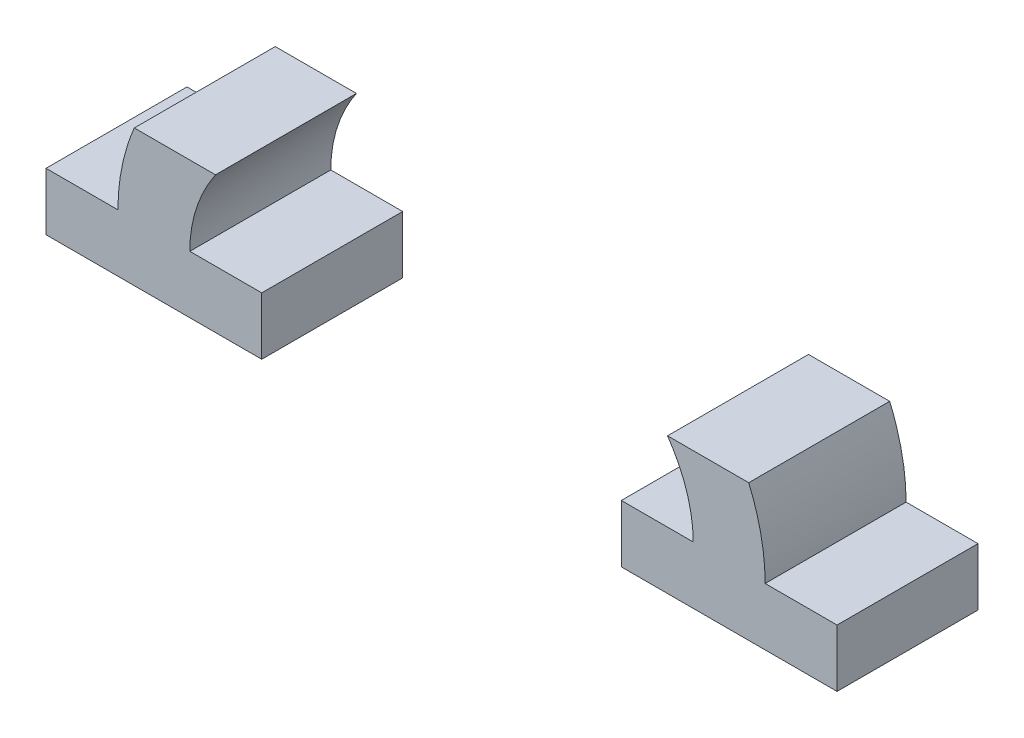
ISO-10303-21;
HEADER;
FILE_DESCRIPTION(('STEP AP214'),'2;1');
FILE_NAME('part.step','',(''),(''),'','','');
FILE_SCHEMA(('AUTOMOTIVE_DESIGN { 1 0 10303 214 1 1 1 1 }'));
ENDSEC;
DATA;
#1=APPLICATION_CONTEXT('core data for automotive mechanical design processes');
#2=APPLICATION_PROTOCOL_DEFINITION('international standard','automotive_design',2000,#1);
#3=PRODUCT_CONTEXT('',#1,'mechanical');
#4=PRODUCT('Part','Part','',(#3));
#5=PRODUCT_RELATED_PRODUCT_CATEGORY('part','',(#4));
#6=PRODUCT_DEFINITION_FORMATION('','',#4);
#7=PRODUCT_DEFINITION_CONTEXT('part definition',#1,'design');
#8=PRODUCT_DEFINITION('design','',#6,#7);
#9=PRODUCT_DEFINITION_SHAPE('','',#8);
#10=(LENGTH_UNIT() NAMED_UNIT(*) SI_UNIT(.MILLI.,.METRE.));
#11=(NAMED_UNIT(*) PLANE_ANGLE_UNIT() SI_UNIT($,.RADIAN.));
#12=(NAMED_UNIT(*) SI_UNIT($,.STERADIAN.) SOLID_ANGLE_UNIT());
#13=UNCERTAINTY_MEASURE_WITH_UNIT(LENGTH_MEASURE(1.E-05),#10,'distance_accuracy_value','');
#14=(GEOMETRIC_REPRESENTATION_CONTEXT(3) GLOBAL_UNCERTAINTY_ASSIGNED_CONTEXT((#13)) GLOBAL_UNIT_ASSIGNED_CONTEXT((#10,
#11,#12)) REPRESENTATION_CONTEXT('',''));
#15=CARTESIAN_POINT('',(0.,0.,0.));
#16=DIRECTION('',(0.,0.,1.));
#17=DIRECTION('',(1.,0.,0.));
#18=AXIS2_PLACEMENT_3D('',#15,#16,#17);
#19=CARTESIAN_POINT('',(-21.3177265453792,7.60000018535409,9.8));
#20=CARTESIAN_POINT('',(-21.4111901957209,7.3786729790947,9.8));
#21=CARTESIAN_POINT('',(-21.5030503403222,7.15674308126442,9.8));
#22=CARTESIAN_POINT('',(-21.6725730609992,6.70754700606256,9.8));
#23=CARTESIAN_POINT('',(-21.7518065374693,6.48087126525906,9.8));
#24=CARTESIAN_POINT('',(-21.9726166268598,5.79449566173458,9.8));
#25=CARTESIAN_POINT('',(-22.0966384821658,5.33062626410484,9.8));
#26=CARTESIAN_POINT('',(-22.2969341143173,4.39036394742074,9.8));
#27=CARTESIAN_POINT('',(-22.3727297923464,3.91620519370957,9.8));
#28=CARTESIAN_POINT('',(-22.4489857839461,3.19918391366948,9.8));
#29=CARTESIAN_POINT('',(-22.4680928075326,2.95979608998371,9.8));
#30=CARTESIAN_POINT('',(-22.4936050503093,2.4803943201275,9.8));
#31=CARTESIAN_POINT('',(-22.4986095178274,2.24028320897447,9.8));
#32=CARTESIAN_POINT('',(-22.5003620168882,1.99999999999999,9.8));
#33=B_SPLINE_CURVE_WITH_KNOTS('',3,(#19,#20,#21,#22,#23,#24,#25,#26,#27,#28,#29,#30,#31,#32),
.UNSPECIFIED.,.F.,.F.,(4,2,2,2,2,2,4),(0.,0.125,0.25,0.5,0.75,0.875,1.),.UNSPECIFIED.);
#34=DIRECTION('',(0.,0.,-1.));
#35=VECTOR('',#34,1.);
#36=SURFACE_OF_LINEAR_EXTRUSION('',#33,#35);
#37=CARTESIAN_POINT('',(-21.3598072357344,7.50000018487524,0.));
#38=CARTESIAN_POINT('',(-21.4386855313831,7.31179641084974,0.));
#39=CARTESIAN_POINT('',(-21.5158098291319,7.12293338146712,0.));
#40=CARTESIAN_POINT('',(-21.6725730609992,6.70754700606256,0.));
#41=CARTESIAN_POINT('',(-21.7518065374693,6.48087126525906,0.));
#42=CARTESIAN_POINT('',(-21.9726166268598,5.79449566173458,0.));
#43=CARTESIAN_POINT('',(-22.0966384821658,5.33062626410484,0.));
#44=CARTESIAN_POINT('',(-22.2969341143173,4.39036394742074,0.));
#45=CARTESIAN_POINT('',(-22.3727297923464,3.91620519370957,0.));
#46=CARTESIAN_POINT('',(-22.4489857839461,3.19918391366948,0.));
#47=CARTESIAN_POINT('',(-22.4680928075326,2.95979608998371,0.));
#48=CARTESIAN_POINT('',(-22.4936050503093,2.4803943201275,0.));
#49=CARTESIAN_POINT('',(-22.4986095178274,2.24028320897447,0.));
#50=CARTESIAN_POINT('',(-22.5003620168882,1.99999999999999,0.));
#51=B_SPLINE_CURVE_WITH_KNOTS('',3,(#37,#38,#39,#40,#41,#42,#43,#44,#45,#46,#47,#48,#49,#50),
.UNSPECIFIED.,.F.,.F.,(4,2,2,2,2,2,4),(0.0188167827279608,0.125,0.25,0.5,0.75,0.875,1.),.UNSPECIFIED.);
#52=CARTESIAN_POINT('',(-21.3598072357345,7.50000018487491,0.));
#53=VERTEX_POINT('',#52);
#54=CARTESIAN_POINT('',(-22.5003620168882,1.99999999999999,0.));
#55=VERTEX_POINT('',#54);
#56=EDGE_CURVE('E227',#53,#55,#51,.T.);
#57=ORIENTED_EDGE('',*,*,#56,.T.);
#58=DIRECTION('',(0.,0.,-1.));
#59=VECTOR('',#58,1.);
#60=CARTESIAN_POINT('',(-22.5003620168882,1.99999999999999,9.8));
#61=LINE('',#60,#59);
#62=CARTESIAN_POINT('',(-22.5003620168882,1.99999999999999,9.8));
#63=VERTEX_POINT('',#62);
#64=EDGE_CURVE('E12',#63,#55,#61,.T.);
#65=ORIENTED_EDGE('',*,*,#64,.F.);
#66=CARTESIAN_POINT('',(-22.5003620168882,1.99999999999999,9.8));
#67=CARTESIAN_POINT('',(-22.4986095178274,2.24028320897447,9.8));
#68=CARTESIAN_POINT('',(-22.4936050503093,2.4803943201275,9.8));
#69=CARTESIAN_POINT('',(-22.4680928075326,2.95979608998371,9.8));
#70=CARTESIAN_POINT('',(-22.4489857839461,3.19918391366948,9.8));
#71=CARTESIAN_POINT('',(-22.3727297923464,3.91620519370957,9.8));
#72=CARTESIAN_POINT('',(-22.2969341143173,4.39036394742074,9.8));
#73=CARTESIAN_POINT('',(-22.0966384821658,5.33062626410484,9.8));
#74=CARTESIAN_POINT('',(-21.9726166268598,5.79449566173458,9.8));
#75=CARTESIAN_POINT('',(-21.7518065374693,6.48087126525906,9.8));
#76=CARTESIAN_POINT('',(-21.6725730609992,6.70754700606256,9.8));
#77=CARTESIAN_POINT('',(-21.5158098291319,7.12293338146712,9.8));
#78=CARTESIAN_POINT('',(-21.4386855313831,7.31179641084974,9.8));
#79=CARTESIAN_POINT('',(-21.3598072357344,7.50000018487524,9.8));
#80=B_SPLINE_CURVE_WITH_KNOTS('',3,(#66,#67,#68,#69,#70,#71,#72,#73,#74,#75,#76,#77,#78,#79),
.UNSPECIFIED.,.F.,.F.,(4,2,2,2,2,2,4),(0.0188167827279608,0.143816782727961,0.268816782727961,
0.518816782727961,0.768816782727961,0.893816782727961,1.),.UNSPECIFIED.);
#81=CARTESIAN_POINT('',(-21.3598072357345,7.50000018487491,9.8));
#82=VERTEX_POINT('',#81);
#83=EDGE_CURVE('E213',#82,#63,#80,.F.);
#84=ORIENTED_EDGE('',*,*,#83,.F.);
#85=DIRECTION('',(0.,0.,-1.));
#86=VECTOR('',#85,1.);
#87=CARTESIAN_POINT('',(-21.3598072357345,7.50000018487491,9.8));
#88=LINE('',#87,#86);
#89=EDGE_CURVE('E278',#82,#53,#88,.T.);
#90=ORIENTED_EDGE('',*,*,#89,.T.);
#91=EDGE_LOOP('',(#57,#65,#84,#90));
#92=FACE_BOUND('',#91,.T.);
#93=ADVANCED_FACE('F43',(#92),#36,.F.);
#94=CARTESIAN_POINT('',(-27.5,1.99999999999999,9.8));
#95=DIRECTION('',(0.,-1.,0.));
#96=DIRECTION('',(1.,0.,0.));
#97=AXIS2_PLACEMENT_3D('',#94,#95,#96);
#98=PLANE('',#97);
#99=DIRECTION('',(-1.,0.,0.));
#100=VECTOR('',#99,1.);
#101=CARTESIAN_POINT('',(-27.5,1.99999999999999,0.));
#102=LINE('',#101,#100);
#103=CARTESIAN_POINT('',(-27.5,1.99999999999999,0.));
#104=VERTEX_POINT('',#103);
#105=EDGE_CURVE('E176',#55,#104,#102,.T.);
#106=ORIENTED_EDGE('',*,*,#105,.T.);
#107=DIRECTION('',(0.,0.,-1.));
#108=VECTOR('',#107,1.);
#109=CARTESIAN_POINT('',(-27.5,1.99999999999999,9.8));
#110=LINE('',#109,#108);
#111=CARTESIAN_POINT('',(-27.5,1.99999999999999,9.8));
#112=VERTEX_POINT('',#111);
#113=EDGE_CURVE('E54',#112,#104,#110,.T.);
#114=ORIENTED_EDGE('',*,*,#113,.F.);
#115=DIRECTION('',(-1.,0.,0.));
#116=VECTOR('',#115,1.);
#117=CARTESIAN_POINT('',(-27.5,1.99999999999999,9.8));
#118=LINE('',#117,#116);
#119=EDGE_CURVE('E107',#63,#112,#118,.T.);
#120=ORIENTED_EDGE('',*,*,#119,.F.);
#121=ORIENTED_EDGE('',*,*,#64,.T.);
#122=EDGE_LOOP('',(#106,#114,#120,#121));
#123=FACE_BOUND('',#122,.T.);
#124=ADVANCED_FACE('F305',(#123),#98,.F.);
#125=CARTESIAN_POINT('',(-27.5,-2.00000000000001,9.8));
#126=DIRECTION('',(1.,0.,0.));
#127=DIRECTION('',(0.,1.,0.));
#128=AXIS2_PLACEMENT_3D('',#125,#126,#127);
#129=PLANE('',#128);
#130=DIRECTION('',(0.,-1.,0.));
#131=VECTOR('',#130,1.);
#132=CARTESIAN_POINT('',(-27.5,-2.00000000000001,0.));
#133=LINE('',#132,#131);
#134=CARTESIAN_POINT('',(-27.5,-2.00000000000001,0.));
#135=VERTEX_POINT('',#134);
#136=EDGE_CURVE('E170',#104,#135,#133,.T.);
#137=ORIENTED_EDGE('',*,*,#136,.T.);
#138=DIRECTION('',(0.,0.,-1.));
#139=VECTOR('',#138,1.);
#140=CARTESIAN_POINT('',(-27.5,-2.00000000000001,9.8));
#141=LINE('',#140,#139);
#142=CARTESIAN_POINT('',(-27.5,-2.00000000000001,9.8));
#143=VERTEX_POINT('',#142);
#144=EDGE_CURVE('E184',#143,#135,#141,.T.);
#145=ORIENTED_EDGE('',*,*,#144,.F.);
#146=DIRECTION('',(0.,-1.,0.));
#147=VECTOR('',#146,1.);
#148=CARTESIAN_POINT('',(-27.5,-2.00000000000001,9.8));
#149=LINE('',#148,#147);
#150=EDGE_CURVE('E193',#112,#143,#149,.T.);
#151=ORIENTED_EDGE('',*,*,#150,.F.);
#152=ORIENTED_EDGE('',*,*,#113,.T.);
#153=EDGE_LOOP('',(#137,#145,#151,#152));
#154=FACE_BOUND('',#153,.T.);
#155=ADVANCED_FACE('F191',(#154),#129,.F.);
#156=CARTESIAN_POINT('',(-12.5,-2.00000000000001,9.8));
#157=DIRECTION('',(0.,1.,0.));
#158=DIRECTION('',(-1.,0.,0.));
#159=AXIS2_PLACEMENT_3D('',#156,#157,#158);
#160=PLANE('',#159);
#161=DIRECTION('',(1.,0.,0.));
#162=VECTOR('',#161,1.);
#163=CARTESIAN_POINT('',(-12.5,-2.00000000000001,0.));
#164=LINE('',#163,#162);
#165=CARTESIAN_POINT('',(-12.5,-2.00000000000001,0.));
#166=VERTEX_POINT('',#165);
#167=EDGE_CURVE('E175',#135,#166,#164,.T.);
#168=ORIENTED_EDGE('',*,*,#167,.T.);
#169=DIRECTION('',(0.,0.,-1.));
#170=VECTOR('',#169,1.);
#171=CARTESIAN_POINT('',(-12.5,-2.00000000000001,9.8));
#172=LINE('',#171,#170);
#173=CARTESIAN_POINT('',(-12.5,-2.00000000000001,9.8));
#174=VERTEX_POINT('',#173);
#175=EDGE_CURVE('E181',#174,#166,#172,.T.);
#176=ORIENTED_EDGE('',*,*,#175,.F.);
#177=DIRECTION('',(1.,0.,0.));
#178=VECTOR('',#177,1.);
#179=CARTESIAN_POINT('',(-12.5,-2.00000000000001,9.8));
#180=LINE('',#179,#178);
#181=EDGE_CURVE('E205',#143,#174,#180,.T.);
#182=ORIENTED_EDGE('',*,*,#181,.F.);
#183=ORIENTED_EDGE('',*,*,#144,.T.);
#184=EDGE_LOOP('',(#168,#176,#182,#183));
#185=FACE_BOUND('',#184,.T.);
#186=ADVANCED_FACE('F201',(#185),#160,.F.);
#187=CARTESIAN_POINT('',(-12.5,1.99999999999999,9.8));
#188=DIRECTION('',(-1.,0.,0.));
#189=DIRECTION('',(0.,-1.,0.));
#190=AXIS2_PLACEMENT_3D('',#187,#188,#189);
#191=PLANE('',#190);
#192=DIRECTION('',(0.,1.,0.));
#193=VECTOR('',#192,1.);
#194=CARTESIAN_POINT('',(-12.5,1.99999999999999,0.));
#195=LINE('',#194,#193);
#196=CARTESIAN_POINT('',(-12.5,1.99999999999999,0.));
#197=VERTEX_POINT('',#196);
#198=EDGE_CURVE('E178',#166,#197,#195,.T.);
#199=ORIENTED_EDGE('',*,*,#198,.T.);
#200=DIRECTION('',(0.,0.,-1.));
#201=VECTOR('',#200,1.);
#202=CARTESIAN_POINT('',(-12.5,1.99999999999999,9.8));
#203=LINE('',#202,#201);
#204=CARTESIAN_POINT('',(-12.5,1.99999999999999,9.8));
#205=VERTEX_POINT('',#204);
#206=EDGE_CURVE('E136',#205,#197,#203,.T.);
#207=ORIENTED_EDGE('',*,*,#206,.F.);
#208=DIRECTION('',(0.,1.,0.));
#209=VECTOR('',#208,1.);
#210=CARTESIAN_POINT('',(-12.5,1.99999999999999,9.8));
#211=LINE('',#210,#209);
#212=EDGE_CURVE('E127',#174,#205,#211,.T.);
#213=ORIENTED_EDGE('',*,*,#212,.F.);
#214=ORIENTED_EDGE('',*,*,#175,.T.);
#215=EDGE_LOOP('',(#199,#207,#213,#214));
#216=FACE_BOUND('',#215,.T.);
#217=ADVANCED_FACE('F204',(#216),#191,.F.);
#218=CARTESIAN_POINT('',(-17.5005710294838,1.99999999999998,9.8));
#219=DIRECTION('',(0.,-1.,0.));
#220=DIRECTION('',(1.,0.,0.));
#221=AXIS2_PLACEMENT_3D('',#218,#219,#220);
#222=PLANE('',#221);
#223=DIRECTION('',(-1.,0.,0.));
#224=VECTOR('',#223,1.);
#225=CARTESIAN_POINT('',(-17.5005710294838,1.99999999999998,0.));
#226=LINE('',#225,#224);
#227=CARTESIAN_POINT('',(-17.5005710294838,1.99999999999998,0.));
#228=VERTEX_POINT('',#227);
#229=EDGE_CURVE('E135',#197,#228,#226,.T.);
#230=ORIENTED_EDGE('',*,*,#229,.T.);
#231=DIRECTION('',(0.,0.,-1.));
#232=VECTOR('',#231,1.);
#233=CARTESIAN_POINT('',(-17.5005710294838,1.99999999999998,9.8));
#234=LINE('',#233,#232);
#235=CARTESIAN_POINT('',(-17.5005710294838,1.99999999999998,9.8));
#236=VERTEX_POINT('',#235);
#237=EDGE_CURVE('E132',#236,#228,#234,.T.);
#238=ORIENTED_EDGE('',*,*,#237,.F.);
#239=DIRECTION('',(-1.,0.,0.));
#240=VECTOR('',#239,1.);
#241=CARTESIAN_POINT('',(-17.5005710294838,1.99999999999998,9.8));
#242=LINE('',#241,#240);
#243=EDGE_CURVE('E120',#205,#236,#242,.T.);
#244=ORIENTED_EDGE('',*,*,#243,.F.);
#245=ORIENTED_EDGE('',*,*,#206,.T.);
#246=EDGE_LOOP('',(#230,#238,#244,#245));
#247=FACE_BOUND('',#246,.T.);
#248=ADVANCED_FACE('F133',(#247),#222,.F.);
#249=CARTESIAN_POINT('',(-17.5005710294838,1.99999999999998,9.8));
#250=CARTESIAN_POINT('',(-17.4977432162879,2.2500307320228,9.8));
#251=CARTESIAN_POINT('',(-17.4894251967412,2.4996075623943,9.8));
#252=CARTESIAN_POINT('',(-17.4474381211403,2.99666533154442,9.8));
#253=CARTESIAN_POINT('',(-17.4160336194876,3.24447377402009,9.8));
#254=CARTESIAN_POINT('',(-17.2911397842608,3.9844894467935,9.8));
#255=CARTESIAN_POINT('',(-17.1678095929667,4.46878932552173,9.8));
#256=CARTESIAN_POINT('',(-16.8469364921912,5.41593287855922,9.8));
#257=CARTESIAN_POINT('',(-16.6507408801863,5.87501027342691,9.8));
#258=CARTESIAN_POINT('',(-16.192761835545,6.76433096611644,9.8));
#259=CARTESIAN_POINT('',(-15.9311505340121,7.18932723825081,9.8));
#260=CARTESIAN_POINT('',(-15.6457771785094,7.59999998775899,9.8));
#261=B_SPLINE_CURVE_WITH_KNOTS('',3,(#249,#250,#251,#252,#253,#254,#255,#256,#257,#258,#259,
#260),.UNSPECIFIED.,.F.,.F.,(4,2,2,2,2,4),(0.,0.125,0.25,0.5,0.75,1.),.UNSPECIFIED.);
#262=DIRECTION('',(0.,0.,-1.));
#263=VECTOR('',#262,1.);
#264=SURFACE_OF_LINEAR_EXTRUSION('',#261,#263);
#265=CARTESIAN_POINT('',(-17.5005710294838,1.99999999999998,0.));
#266=CARTESIAN_POINT('',(-17.4977432162879,2.2500307320228,0.));
#267=CARTESIAN_POINT('',(-17.4894251967412,2.4996075623943,0.));
#268=CARTESIAN_POINT('',(-17.4474381211403,2.99666533154442,0.));
#269=CARTESIAN_POINT('',(-17.4160336194876,3.24447377402009,0.));
#270=CARTESIAN_POINT('',(-17.2911397842608,3.9844894467935,0.));
#271=CARTESIAN_POINT('',(-17.1678095929667,4.46878932552173,0.));
#272=CARTESIAN_POINT('',(-16.8469364921912,5.41593287855922,0.));
#273=CARTESIAN_POINT('',(-16.6507408801863,5.87501027342691,0.));
#274=CARTESIAN_POINT('',(-16.2112954781201,6.72834165165811,0.));
#275=CARTESIAN_POINT('',(-15.9732847167901,7.12040288330009,0.));
#276=CARTESIAN_POINT('',(-15.7145969858173,7.50000024953311,0.));
#277=B_SPLINE_CURVE_WITH_KNOTS('',3,(#265,#266,#267,#268,#269,#270,#271,#272,#273,#274,#275,
#276),.UNSPECIFIED.,.F.,.F.,(4,2,2,2,2,4),(0.,0.125,0.25,0.5,0.75,0.979765839952803),.UNSPECIFIED.);
#278=CARTESIAN_POINT('',(-15.7145969858172,7.50000024953309,0.));
#279=VERTEX_POINT('',#278);
#280=EDGE_CURVE('E92',#228,#279,#277,.T.);
#281=ORIENTED_EDGE('',*,*,#280,.T.);
#282=DIRECTION('',(0.,0.,-1.));
#283=VECTOR('',#282,1.);
#284=CARTESIAN_POINT('',(-15.7145969858172,7.50000024953309,9.8));
#285=LINE('',#284,#283);
#286=CARTESIAN_POINT('',(-15.7145969858172,7.50000024953309,9.8));
#287=VERTEX_POINT('',#286);
#288=EDGE_CURVE('E137',#287,#279,#285,.T.);
#289=ORIENTED_EDGE('',*,*,#288,.F.);
#290=CARTESIAN_POINT('',(-15.7145969858173,7.50000024953311,9.8));
#291=CARTESIAN_POINT('',(-15.9732847167901,7.12040288330009,9.8));
#292=CARTESIAN_POINT('',(-16.2112954781201,6.72834165165811,9.8));
#293=CARTESIAN_POINT('',(-16.6507408801863,5.87501027342691,9.8));
#294=CARTESIAN_POINT('',(-16.8469364921912,5.41593287855922,9.8));
#295=CARTESIAN_POINT('',(-17.1678095929667,4.46878932552173,9.8));
#296=CARTESIAN_POINT('',(-17.2911397842608,3.9844894467935,9.8));
#297=CARTESIAN_POINT('',(-17.4160336194876,3.24447377402009,9.8));
#298=CARTESIAN_POINT('',(-17.4474381211403,2.99666533154442,9.8));
#299=CARTESIAN_POINT('',(-17.4894251967412,2.4996075623943,9.8));
#300=CARTESIAN_POINT('',(-17.4977432162879,2.2500307320228,9.8));
#301=CARTESIAN_POINT('',(-17.5005710294838,1.99999999999998,9.8));
#302=B_SPLINE_CURVE_WITH_KNOTS('',3,(#290,#291,#292,#293,#294,#295,#296,#297,#298,#299,#300,
#301),.UNSPECIFIED.,.F.,.F.,(4,2,2,2,2,4),(0.,0.229765839952803,0.479765839952803,
0.729765839952804,0.854765839952803,0.979765839952803),.UNSPECIFIED.);
#303=EDGE_CURVE('E124',#236,#287,#302,.F.);
#304=ORIENTED_EDGE('',*,*,#303,.F.);
#305=ORIENTED_EDGE('',*,*,#237,.T.);
#306=EDGE_LOOP('',(#281,#289,#304,#305));
#307=FACE_BOUND('',#306,.T.);
#308=ADVANCED_FACE('F140',(#307),#264,.F.);
#309=CARTESIAN_POINT('',(-15.7145969858172,7.50000024953309,9.8));
#310=DIRECTION('',(1.14536343055286E-08,-1.,0.));
#311=DIRECTION('',(1.,1.14536343055286E-08,0.));
#312=AXIS2_PLACEMENT_3D('',#309,#310,#311);
#313=PLANE('',#312);
#314=DIRECTION('',(-1.,-1.14536343055286E-08,0.));
#315=VECTOR('',#314,1.);
#316=CARTESIAN_POINT('',(-15.7145969858172,7.50000024953309,0.));
#317=LINE('',#316,#315);
#318=EDGE_CURVE('E99',#279,#53,#317,.T.);
#319=ORIENTED_EDGE('',*,*,#318,.T.);
#320=ORIENTED_EDGE('',*,*,#89,.F.);
#321=DIRECTION('',(-1.,-1.14536343055286E-08,0.));
#322=VECTOR('',#321,1.);
#323=CARTESIAN_POINT('',(-15.7145969858172,7.50000024953309,9.8));
#324=LINE('',#323,#322);
#325=EDGE_CURVE('E63',#287,#82,#324,.T.);
#326=ORIENTED_EDGE('',*,*,#325,.F.);
#327=ORIENTED_EDGE('',*,*,#288,.T.);
#328=EDGE_LOOP('',(#319,#320,#326,#327));
#329=FACE_BOUND('',#328,.T.);
#330=ADVANCED_FACE('F160',(#329),#313,.F.);
#331=CARTESIAN_POINT('',(-22.1967862982415,4.86049510576279,9.8));
#332=DIRECTION('',(0.,0.,1.));
#333=DIRECTION('',(1.,0.,0.));
#334=AXIS2_PLACEMENT_3D('',#331,#332,#333);
#335=PLANE('',#334);
#336=ORIENTED_EDGE('',*,*,#83,.T.);
#337=ORIENTED_EDGE('',*,*,#119,.T.);
#338=ORIENTED_EDGE('',*,*,#150,.T.);
#339=ORIENTED_EDGE('',*,*,#181,.T.);
#340=ORIENTED_EDGE('',*,*,#212,.T.);
#341=ORIENTED_EDGE('',*,*,#243,.T.);
#342=ORIENTED_EDGE('',*,*,#303,.T.);
#343=ORIENTED_EDGE('',*,*,#325,.T.);
#344=EDGE_LOOP('',(#336,#337,#338,#339,#340,#341,#342,#343));
#345=FACE_BOUND('',#344,.T.);
#346=ADVANCED_FACE('F122',(#345),#335,.T.);
#347=CARTESIAN_POINT('',(-22.1967862982415,4.86049510576279,0.));
#348=DIRECTION('',(0.,0.,1.));
#349=DIRECTION('',(1.,0.,0.));
#350=AXIS2_PLACEMENT_3D('',#347,#348,#349);
#351=PLANE('',#350);
#352=ORIENTED_EDGE('',*,*,#56,.F.);
#353=ORIENTED_EDGE('',*,*,#318,.F.);
#354=ORIENTED_EDGE('',*,*,#280,.F.);
#355=ORIENTED_EDGE('',*,*,#229,.F.);
#356=ORIENTED_EDGE('',*,*,#198,.F.);
#357=ORIENTED_EDGE('',*,*,#167,.F.);
#358=ORIENTED_EDGE('',*,*,#136,.F.);
#359=ORIENTED_EDGE('',*,*,#105,.F.);
#360=EDGE_LOOP('',(#352,#353,#354,#355,#356,#357,#358,#359));
#361=FACE_BOUND('',#360,.T.);
#362=ADVANCED_FACE('F197',(#361),#351,.F.);
#363=CLOSED_SHELL('',(#93,#124,#155,#186,#217,#248,#308,#330,#346,#362));
#364=MANIFOLD_SOLID_BREP('B2',#363);
#365=CARTESIAN_POINT('',(15.6457902122538,7.59999998786423,9.8));
#366=CARTESIAN_POINT('',(15.931568714932,7.18874231723947,9.8));
#367=CARTESIAN_POINT('',(16.1924478842107,6.7645612321594,9.8));
#368=CARTESIAN_POINT('',(16.6475566811961,5.8816061821348,9.8));
#369=CARTESIAN_POINT('',(16.8442316362413,5.42292453430899,9.8));
#370=CARTESIAN_POINT('',(17.166508355254,4.47364599918492,9.8));
#371=CARTESIAN_POINT('',(17.2902479508353,3.98874580222171,9.8));
#372=CARTESIAN_POINT('',(17.415689773968,3.24704608635348,9.8));
#373=CARTESIAN_POINT('',(17.44720165679,2.99891030729487,9.8));
#374=CARTESIAN_POINT('',(17.4893726912014,2.50081188771663,9.8));
#375=CARTESIAN_POINT('',(17.497736554441,2.25064816208341,9.8));
#376=CARTESIAN_POINT('',(17.5005708122286,2.00000000000001,9.8));
#377=B_SPLINE_CURVE_WITH_KNOTS('',3,(#365,#366,#367,#368,#369,#370,#371,#372,#373,#374,#375,
#376),.UNSPECIFIED.,.F.,.F.,(4,2,2,2,2,4),(0.,0.25,0.5,0.75,0.875,1.),.UNSPECIFIED.);
#378=DIRECTION('',(0.,0.,-1.));
#379=VECTOR('',#378,1.);
#380=SURFACE_OF_LINEAR_EXTRUSION('',#377,#379);
#381=CARTESIAN_POINT('',(15.7146090835497,7.49999952658106,0.));
#382=CARTESIAN_POINT('',(15.9735326150674,7.12004317390334,0.));
#383=CARTESIAN_POINT('',(16.2108445879027,6.72886984905218,0.));
#384=CARTESIAN_POINT('',(16.6475566811961,5.8816061821348,0.));
#385=CARTESIAN_POINT('',(16.8442316362413,5.42292453430899,0.));
#386=CARTESIAN_POINT('',(17.166508355254,4.47364599918492,0.));
#387=CARTESIAN_POINT('',(17.2902479508353,3.98874580222171,0.));
#388=CARTESIAN_POINT('',(17.415689773968,3.24704608635348,0.));
#389=CARTESIAN_POINT('',(17.44720165679,2.99891030729487,0.));
#390=CARTESIAN_POINT('',(17.4893726912014,2.50081188771663,0.));
#391=CARTESIAN_POINT('',(17.497736554441,2.25064816208341,0.));
#392=CARTESIAN_POINT('',(17.5005708122286,2.00000000000001,0.));
#393=B_SPLINE_CURVE_WITH_KNOTS('',3,(#381,#382,#383,#384,#385,#386,#387,#388,#389,#390,#391,
#392),.UNSPECIFIED.,.F.,.F.,(4,2,2,2,2,4),(0.0202113250873961,0.25,0.5,0.75,0.875,1.),.UNSPECIFIED.);
#394=CARTESIAN_POINT('',(15.7146090835497,7.49999952658106,0.));
#395=VERTEX_POINT('',#394);
#396=CARTESIAN_POINT('',(17.5005708122286,2.00000000000001,0.));
#397=VERTEX_POINT('',#396);
#398=EDGE_CURVE('E565',#395,#397,#393,.T.);
#399=ORIENTED_EDGE('',*,*,#398,.T.);
#400=DIRECTION('',(0.,0.,-1.));
#401=VECTOR('',#400,1.);
#402=CARTESIAN_POINT('',(17.5005708122286,2.00000000000001,9.8));
#403=LINE('',#402,#401);
#404=CARTESIAN_POINT('',(17.5005708122286,2.00000000000001,9.8));
#405=VERTEX_POINT('',#404);
#406=EDGE_CURVE('E41',#405,#397,#403,.T.);
#407=ORIENTED_EDGE('',*,*,#406,.F.);
#408=CARTESIAN_POINT('',(17.5005708122286,2.00000000000001,9.8));
#409=CARTESIAN_POINT('',(17.497736554441,2.25064816208341,9.8));
#410=CARTESIAN_POINT('',(17.4893726912014,2.50081188771663,9.8));
#411=CARTESIAN_POINT('',(17.44720165679,2.99891030729487,9.8));
#412=CARTESIAN_POINT('',(17.415689773968,3.24704608635348,9.8));
#413=CARTESIAN_POINT('',(17.2902479508353,3.98874580222171,9.8));
#414=CARTESIAN_POINT('',(17.166508355254,4.47364599918492,9.8));
#415=CARTESIAN_POINT('',(16.8442316362413,5.42292453430899,9.8));
#416=CARTESIAN_POINT('',(16.6475566811961,5.8816061821348,9.8));
#417=CARTESIAN_POINT('',(16.2108445879027,6.72886984905218,9.8));
#418=CARTESIAN_POINT('',(15.9735326150674,7.12004317390334,9.8));
#419=CARTESIAN_POINT('',(15.7146090835497,7.49999952658106,9.8));
#420=B_SPLINE_CURVE_WITH_KNOTS('',3,(#408,#409,#410,#411,#412,#413,#414,#415,#416,#417,#418,
#419),.UNSPECIFIED.,.F.,.F.,(4,2,2,2,2,4),(0.0202113250873961,0.145211325087396,
0.270211325087396,0.520211325087396,0.770211325087396,1.),.UNSPECIFIED.);
#421=CARTESIAN_POINT('',(15.7146090835497,7.49999952658106,9.8));
#422=VERTEX_POINT('',#421);
#423=EDGE_CURVE('E551',#422,#405,#420,.F.);
#424=ORIENTED_EDGE('',*,*,#423,.F.);
#425=DIRECTION('',(0.,0.,-1.));
#426=VECTOR('',#425,1.);
#427=CARTESIAN_POINT('',(15.7146090835497,7.49999952658106,9.8));
#428=LINE('',#427,#426);
#429=EDGE_CURVE('E616',#422,#395,#428,.T.);
#430=ORIENTED_EDGE('',*,*,#429,.T.);
#431=EDGE_LOOP('',(#399,#407,#424,#430));
#432=FACE_BOUND('',#431,.T.);
#433=ADVANCED_FACE('F381',(#432),#380,.F.);
#434=CARTESIAN_POINT('',(12.5,2.,9.8));
#435=DIRECTION('',(0.,-1.,0.));
#436=DIRECTION('',(1.,0.,0.));
#437=AXIS2_PLACEMENT_3D('',#434,#435,#436);
#438=PLANE('',#437);
#439=DIRECTION('',(-1.,0.,0.));
#440=VECTOR('',#439,1.);
#441=CARTESIAN_POINT('',(12.5,2.,0.));
#442=LINE('',#441,#440);
#443=CARTESIAN_POINT('',(12.5,2.,0.));
#444=VERTEX_POINT('',#443);
#445=EDGE_CURVE('E514',#397,#444,#442,.T.);
#446=ORIENTED_EDGE('',*,*,#445,.T.);
#447=DIRECTION('',(0.,0.,-1.));
#448=VECTOR('',#447,1.);
#449=CARTESIAN_POINT('',(12.5,2.,9.8));
#450=LINE('',#449,#448);
#451=CARTESIAN_POINT('',(12.5,2.,9.8));
#452=VERTEX_POINT('',#451);
#453=EDGE_CURVE('E392',#452,#444,#450,.T.);
#454=ORIENTED_EDGE('',*,*,#453,.F.);
#455=DIRECTION('',(-1.,0.,0.));
#456=VECTOR('',#455,1.);
#457=CARTESIAN_POINT('',(12.5,2.,9.8));
#458=LINE('',#457,#456);
#459=EDGE_CURVE('E445',#405,#452,#458,.T.);
#460=ORIENTED_EDGE('',*,*,#459,.F.);
#461=ORIENTED_EDGE('',*,*,#406,.T.);
#462=EDGE_LOOP('',(#446,#454,#460,#461));
#463=FACE_BOUND('',#462,.T.);
#464=ADVANCED_FACE('F643',(#463),#438,.F.);
#465=CARTESIAN_POINT('',(12.5,-2.,9.8));
#466=DIRECTION('',(1.,0.,0.));
#467=DIRECTION('',(0.,1.,0.));
#468=AXIS2_PLACEMENT_3D('',#465,#466,#467);
#469=PLANE('',#468);
#470=DIRECTION('',(0.,-1.,0.));
#471=VECTOR('',#470,1.);
#472=CARTESIAN_POINT('',(12.5,-2.,0.));
#473=LINE('',#472,#471);
#474=CARTESIAN_POINT('',(12.5,-2.,0.));
#475=VERTEX_POINT('',#474);
#476=EDGE_CURVE('E508',#444,#475,#473,.T.);
#477=ORIENTED_EDGE('',*,*,#476,.T.);
#478=DIRECTION('',(0.,0.,-1.));
#479=VECTOR('',#478,1.);
#480=CARTESIAN_POINT('',(12.5,-2.,9.8));
#481=LINE('',#480,#479);
#482=CARTESIAN_POINT('',(12.5,-2.,9.8));
#483=VERTEX_POINT('',#482);
#484=EDGE_CURVE('E522',#483,#475,#481,.T.);
#485=ORIENTED_EDGE('',*,*,#484,.F.);
#486=DIRECTION('',(0.,-1.,0.));
#487=VECTOR('',#486,1.);
#488=CARTESIAN_POINT('',(12.5,-2.,9.8));
#489=LINE('',#488,#487);
#490=EDGE_CURVE('E531',#452,#483,#489,.T.);
#491=ORIENTED_EDGE('',*,*,#490,.F.);
#492=ORIENTED_EDGE('',*,*,#453,.T.);
#493=EDGE_LOOP('',(#477,#485,#491,#492));
#494=FACE_BOUND('',#493,.T.);
#495=ADVANCED_FACE('F529',(#494),#469,.F.);
#496=CARTESIAN_POINT('',(27.5,-2.,9.8));
#497=DIRECTION('',(0.,1.,0.));
#498=DIRECTION('',(0.,0.,1.));
#499=AXIS2_PLACEMENT_3D('',#496,#497,#498);
#500=PLANE('',#499);
#501=DIRECTION('',(1.,0.,0.));
#502=VECTOR('',#501,1.);
#503=CARTESIAN_POINT('',(27.5,-2.,0.));
#504=LINE('',#503,#502);
#505=CARTESIAN_POINT('',(27.5,-2.,0.));
#506=VERTEX_POINT('',#505);
#507=EDGE_CURVE('E513',#475,#506,#504,.T.);
#508=ORIENTED_EDGE('',*,*,#507,.T.);
#509=DIRECTION('',(0.,0.,-1.));
#510=VECTOR('',#509,1.);
#511=CARTESIAN_POINT('',(27.5,-2.,9.8));
#512=LINE('',#511,#510);
#513=CARTESIAN_POINT('',(27.5,-2.,9.8));
#514=VERTEX_POINT('',#513);
#515=EDGE_CURVE('E519',#514,#506,#512,.T.);
#516=ORIENTED_EDGE('',*,*,#515,.F.);
#517=DIRECTION('',(1.,0.,0.));
#518=VECTOR('',#517,1.);
#519=CARTESIAN_POINT('',(27.5,-2.,9.8));
#520=LINE('',#519,#518);
#521=EDGE_CURVE('E543',#483,#514,#520,.T.);
#522=ORIENTED_EDGE('',*,*,#521,.F.);
#523=ORIENTED_EDGE('',*,*,#484,.T.);
#524=EDGE_LOOP('',(#508,#516,#522,#523));
#525=FACE_BOUND('',#524,.T.);
#526=ADVANCED_FACE('F539',(#525),#500,.F.);
#527=CARTESIAN_POINT('',(27.5,2.,9.8));
#528=DIRECTION('',(-1.,0.,0.));
#529=DIRECTION('',(0.,-1.,0.));
#530=AXIS2_PLACEMENT_3D('',#527,#528,#529);
#531=PLANE('',#530);
#532=DIRECTION('',(0.,1.,0.));
#533=VECTOR('',#532,1.);
#534=CARTESIAN_POINT('',(27.5,2.,0.));
#535=LINE('',#534,#533);
#536=CARTESIAN_POINT('',(27.5,2.,0.));
#537=VERTEX_POINT('',#536);
#538=EDGE_CURVE('E516',#506,#537,#535,.T.);
#539=ORIENTED_EDGE('',*,*,#538,.T.);
#540=DIRECTION('',(0.,0.,-1.));
#541=VECTOR('',#540,1.);
#542=CARTESIAN_POINT('',(27.5,2.,9.8));
#543=LINE('',#542,#541);
#544=CARTESIAN_POINT('',(27.5,2.,9.8));
#545=VERTEX_POINT('',#544);
#546=EDGE_CURVE('E474',#545,#537,#543,.T.);
#547=ORIENTED_EDGE('',*,*,#546,.F.);
#548=DIRECTION('',(0.,1.,0.));
#549=VECTOR('',#548,1.);
#550=CARTESIAN_POINT('',(27.5,2.,9.8));
#551=LINE('',#550,#549);
#552=EDGE_CURVE('E465',#514,#545,#551,.T.);
#553=ORIENTED_EDGE('',*,*,#552,.F.);
#554=ORIENTED_EDGE('',*,*,#515,.T.);
#555=EDGE_LOOP('',(#539,#547,#553,#554));
#556=FACE_BOUND('',#555,.T.);
#557=ADVANCED_FACE('F542',(#556),#531,.F.);
#558=CARTESIAN_POINT('',(22.5003620168882,1.99999999999998,9.8));
#559=DIRECTION('',(0.,-1.,0.));
#560=DIRECTION('',(1.,0.,0.));
#561=AXIS2_PLACEMENT_3D('',#558,#559,#560);
#562=PLANE('',#561);
#563=DIRECTION('',(-1.,0.,0.));
#564=VECTOR('',#563,1.);
#565=CARTESIAN_POINT('',(22.5003620168882,1.99999999999998,0.));
#566=LINE('',#565,#564);
#567=CARTESIAN_POINT('',(22.5003620168882,1.99999999999998,0.));
#568=VERTEX_POINT('',#567);
#569=EDGE_CURVE('E473',#537,#568,#566,.T.);
#570=ORIENTED_EDGE('',*,*,#569,.T.);
#571=DIRECTION('',(0.,0.,-1.));
#572=VECTOR('',#571,1.);
#573=CARTESIAN_POINT('',(22.5003620168882,1.99999999999998,9.8));
#574=LINE('',#573,#572);
#575=CARTESIAN_POINT('',(22.5003620168882,1.99999999999998,9.8));
#576=VERTEX_POINT('',#575);
#577=EDGE_CURVE('E470',#576,#568,#574,.T.);
#578=ORIENTED_EDGE('',*,*,#577,.F.);
#579=DIRECTION('',(-1.,0.,0.));
#580=VECTOR('',#579,1.);
#581=CARTESIAN_POINT('',(22.5003620168882,1.99999999999998,9.8));
#582=LINE('',#581,#580);
#583=EDGE_CURVE('E458',#545,#576,#582,.T.);
#584=ORIENTED_EDGE('',*,*,#583,.F.);
#585=ORIENTED_EDGE('',*,*,#546,.T.);
#586=EDGE_LOOP('',(#570,#578,#584,#585));
#587=FACE_BOUND('',#586,.T.);
#588=ADVANCED_FACE('F471',(#587),#562,.F.);
#589=CARTESIAN_POINT('',(22.5003620168882,1.99999999999998,9.8));
#590=CARTESIAN_POINT('',(22.498609529895,2.2402815543879,9.8));
#591=CARTESIAN_POINT('',(22.4936050400666,2.48038693312376,9.8));
#592=CARTESIAN_POINT('',(22.468095241,2.95975794133783,9.8));
#593=CARTESIAN_POINT('',(22.4489931240274,3.19909958806597,9.8));
#594=CARTESIAN_POINT('',(22.3727444120066,3.91609833516637,9.8));
#595=CARTESIAN_POINT('',(22.2969572838839,4.39023300686886,9.8));
#596=CARTESIAN_POINT('',(22.0966714866529,5.33049349650318,9.8));
#597=CARTESIAN_POINT('',(21.9726435776014,5.79440253748219,9.8));
#598=CARTESIAN_POINT('',(21.7518324981178,6.48079524151021,9.8));
#599=CARTESIAN_POINT('',(21.6725860192632,6.70751157233164,9.8));
#600=CARTESIAN_POINT('',(21.5030540536267,7.15673433907959,9.8));
#601=CARTESIAN_POINT('',(21.4111917746172,7.37866924017919,9.8));
#602=CARTESIAN_POINT('',(21.3177267721522,7.59999964834281,9.8));
#603=B_SPLINE_CURVE_WITH_KNOTS('',3,(#589,#590,#591,#592,#593,#594,#595,#596,#597,#598,#599,
#600,#601,#602),.UNSPECIFIED.,.F.,.F.,(4,2,2,2,2,2,4),(0.,0.125,0.25,0.5,0.75,0.875,1.),.UNSPECIFIED.);
#604=DIRECTION('',(0.,0.,-1.));
#605=VECTOR('',#604,1.);
#606=SURFACE_OF_LINEAR_EXTRUSION('',#603,#605);
#607=CARTESIAN_POINT('',(22.5003620168882,1.99999999999998,0.));
#608=CARTESIAN_POINT('',(22.498609529895,2.2402815543879,0.));
#609=CARTESIAN_POINT('',(22.4936050400666,2.48038693312376,0.));
#610=CARTESIAN_POINT('',(22.468095241,2.95975794133783,0.));
#611=CARTESIAN_POINT('',(22.4489931240274,3.19909958806597,0.));
#612=CARTESIAN_POINT('',(22.3727444120066,3.91609833516637,0.));
#613=CARTESIAN_POINT('',(22.2969572838839,4.39023300686886,0.));
#614=CARTESIAN_POINT('',(22.0966714866529,5.33049349650318,0.));
#615=CARTESIAN_POINT('',(21.9726435776014,5.79440253748219,0.));
#616=CARTESIAN_POINT('',(21.7518324981178,6.48079524151021,0.));
#617=CARTESIAN_POINT('',(21.6725860192632,6.70751157233164,0.));
#618=CARTESIAN_POINT('',(21.5158140352314,7.12292316831558,0.));
#619=CARTESIAN_POINT('',(21.4386873742912,7.31179204172808,0.));
#620=CARTESIAN_POINT('',(21.3598074648396,7.49999964925804,0.));
#621=B_SPLINE_CURVE_WITH_KNOTS('',3,(#607,#608,#609,#610,#611,#612,#613,#614,#615,#616,#617,
#618,#619,#620),.UNSPECIFIED.,.F.,.F.,(4,2,2,2,2,2,4),(0.,0.125,0.25,0.5,0.75,0.875,
0.981183516694416),.UNSPECIFIED.);
#622=CARTESIAN_POINT('',(21.3598074648397,7.49999964925774,0.));
#623=VERTEX_POINT('',#622);
#624=EDGE_CURVE('E430',#568,#623,#621,.T.);
#625=ORIENTED_EDGE('',*,*,#624,.T.);
#626=DIRECTION('',(0.,0.,-1.));
#627=VECTOR('',#626,1.);
#628=CARTESIAN_POINT('',(21.3598074648397,7.49999964925774,9.8));
#629=LINE('',#628,#627);
#630=CARTESIAN_POINT('',(21.3598074648397,7.49999964925774,9.8));
#631=VERTEX_POINT('',#630);
#632=EDGE_CURVE('E475',#631,#623,#629,.T.);
#633=ORIENTED_EDGE('',*,*,#632,.F.);
#634=CARTESIAN_POINT('',(21.3598074648396,7.49999964925804,9.8));
#635=CARTESIAN_POINT('',(21.4386873742912,7.31179204172808,9.8));
#636=CARTESIAN_POINT('',(21.5158140352314,7.12292316831558,9.8));
#637=CARTESIAN_POINT('',(21.6725860192632,6.70751157233164,9.8));
#638=CARTESIAN_POINT('',(21.7518324981178,6.48079524151021,9.8));
#639=CARTESIAN_POINT('',(21.9726435776014,5.79440253748219,9.8));
#640=CARTESIAN_POINT('',(22.0966714866529,5.33049349650318,9.8));
#641=CARTESIAN_POINT('',(22.2969572838839,4.39023300686886,9.8));
#642=CARTESIAN_POINT('',(22.3727444120066,3.91609833516637,9.8));
#643=CARTESIAN_POINT('',(22.4489931240274,3.19909958806597,9.8));
#644=CARTESIAN_POINT('',(22.468095241,2.95975794133783,9.8));
#645=CARTESIAN_POINT('',(22.4936050400666,2.48038693312376,9.8));
#646=CARTESIAN_POINT('',(22.498609529895,2.2402815543879,9.8));
#647=CARTESIAN_POINT('',(22.5003620168882,1.99999999999998,9.8));
#648=B_SPLINE_CURVE_WITH_KNOTS('',3,(#634,#635,#636,#637,#638,#639,#640,#641,#642,#643,#644,
#645,#646,#647),.UNSPECIFIED.,.F.,.F.,(4,2,2,2,2,2,4),(0.,0.106183516694416,0.231183516694417,
0.481183516694416,0.731183516694416,0.856183516694416,0.981183516694416),.UNSPECIFIED.);
#649=EDGE_CURVE('E462',#576,#631,#648,.F.);
#650=ORIENTED_EDGE('',*,*,#649,.F.);
#651=ORIENTED_EDGE('',*,*,#577,.T.);
#652=EDGE_LOOP('',(#625,#633,#650,#651));
#653=FACE_BOUND('',#652,.T.);
#654=ADVANCED_FACE('F478',(#653),#606,.F.);
#655=CARTESIAN_POINT('',(21.3598074648397,7.49999964925774,9.8));
#656=DIRECTION('',(2.17311548966307E-08,-1.,0.));
#657=DIRECTION('',(1.,2.17311548966307E-08,0.));
#658=AXIS2_PLACEMENT_3D('',#655,#656,#657);
#659=PLANE('',#658);
#660=DIRECTION('',(-1.,-2.17311548966307E-08,0.));
#661=VECTOR('',#660,1.);
#662=CARTESIAN_POINT('',(21.3598074648397,7.49999964925774,0.));
#663=LINE('',#662,#661);
#664=EDGE_CURVE('E437',#623,#395,#663,.T.);
#665=ORIENTED_EDGE('',*,*,#664,.T.);
#666=ORIENTED_EDGE('',*,*,#429,.F.);
#667=DIRECTION('',(-1.,-2.17311548966307E-08,0.));
#668=VECTOR('',#667,1.);
#669=CARTESIAN_POINT('',(21.3598074648397,7.49999964925774,9.8));
#670=LINE('',#669,#668);
#671=EDGE_CURVE('E401',#631,#422,#670,.T.);
#672=ORIENTED_EDGE('',*,*,#671,.F.);
#673=ORIENTED_EDGE('',*,*,#632,.T.);
#674=EDGE_LOOP('',(#665,#666,#672,#673));
#675=FACE_BOUND('',#674,.T.);
#676=ADVANCED_FACE('F498',(#675),#659,.F.);
#677=CARTESIAN_POINT('',(17.0053699957476,4.94828526674696,9.8));
#678=DIRECTION('',(0.,0.,-1.));
#679=DIRECTION('',(-1.,0.,0.));
#680=AXIS2_PLACEMENT_3D('',#677,#678,#679);
#681=PLANE('',#680);
#682=ORIENTED_EDGE('',*,*,#423,.T.);
#683=ORIENTED_EDGE('',*,*,#459,.T.);
#684=ORIENTED_EDGE('',*,*,#490,.T.);
#685=ORIENTED_EDGE('',*,*,#521,.T.);
#686=ORIENTED_EDGE('',*,*,#552,.T.);
#687=ORIENTED_EDGE('',*,*,#583,.T.);
#688=ORIENTED_EDGE('',*,*,#649,.T.);
#689=ORIENTED_EDGE('',*,*,#671,.T.);
#690=EDGE_LOOP('',(#682,#683,#684,#685,#686,#687,#688,#689));
#691=FACE_BOUND('',#690,.T.);
#692=ADVANCED_FACE('F460',(#691),#681,.F.);
#693=CARTESIAN_POINT('',(17.0053699957476,4.94828526674696,0.));
#694=DIRECTION('',(0.,0.,-1.));
#695=DIRECTION('',(-1.,0.,0.));
#696=AXIS2_PLACEMENT_3D('',#693,#694,#695);
#697=PLANE('',#696);
#698=ORIENTED_EDGE('',*,*,#398,.F.);
#699=ORIENTED_EDGE('',*,*,#664,.F.);
#700=ORIENTED_EDGE('',*,*,#624,.F.);
#701=ORIENTED_EDGE('',*,*,#569,.F.);
#702=ORIENTED_EDGE('',*,*,#538,.F.);
#703=ORIENTED_EDGE('',*,*,#507,.F.);
#704=ORIENTED_EDGE('',*,*,#476,.F.);
#705=ORIENTED_EDGE('',*,*,#445,.F.);
#706=EDGE_LOOP('',(#698,#699,#700,#701,#702,#703,#704,#705));
#707=FACE_BOUND('',#706,.T.);
#708=ADVANCED_FACE('F535',(#707),#697,.T.);
#709=CLOSED_SHELL('',(#433,#464,#495,#526,#557,#588,#654,#676,#692,#708));
#710=MANIFOLD_SOLID_BREP('B6',#709);
#711=ADVANCED_BREP_SHAPE_REPRESENTATION('',(#18,#364,#710),#14);
#712=SHAPE_DEFINITION_REPRESENTATION(#9,#711);
ENDSEC;
END-ISO-10303-21;
